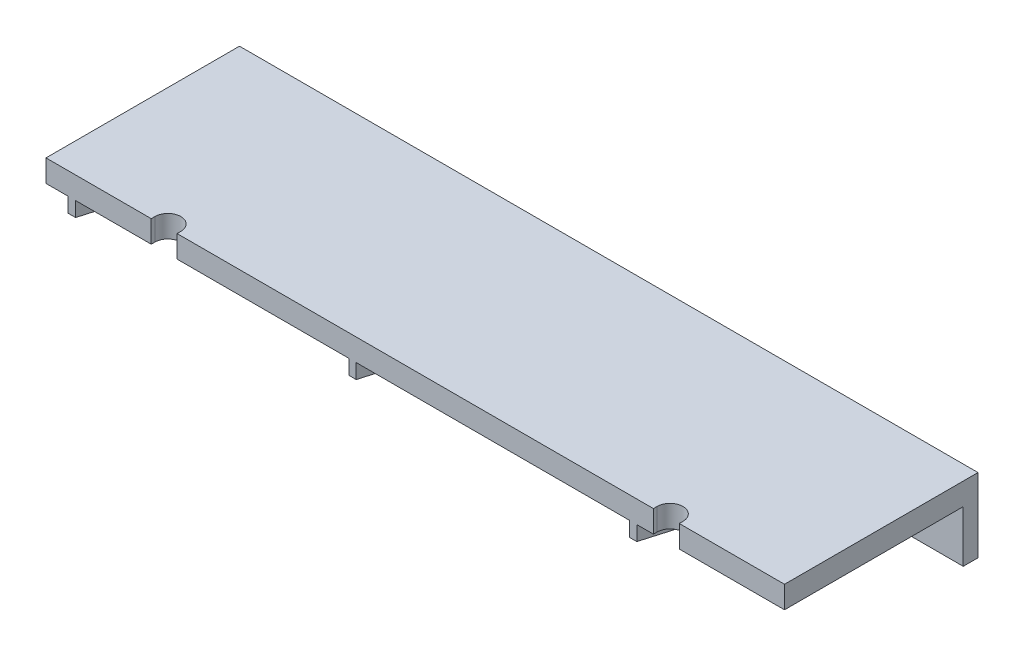
ISO-10303-21;
HEADER;
FILE_DESCRIPTION(('STEP AP214'),'2;1');
FILE_NAME('part.step','',(''),(''),'','','');
FILE_SCHEMA(('AUTOMOTIVE_DESIGN { 1 0 10303 214 1 1 1 1 }'));
ENDSEC;
DATA;
#1=APPLICATION_CONTEXT('core data for automotive mechanical design processes');
#2=APPLICATION_PROTOCOL_DEFINITION('international standard','automotive_design',2000,#1);
#3=PRODUCT_CONTEXT('',#1,'mechanical');
#4=PRODUCT('Part','Part','',(#3));
#5=PRODUCT_RELATED_PRODUCT_CATEGORY('part','',(#4));
#6=PRODUCT_DEFINITION_FORMATION('','',#4);
#7=PRODUCT_DEFINITION_CONTEXT('part definition',#1,'design');
#8=PRODUCT_DEFINITION('design','',#6,#7);
#9=PRODUCT_DEFINITION_SHAPE('','',#8);
#10=(LENGTH_UNIT() NAMED_UNIT(*) SI_UNIT(.MILLI.,.METRE.));
#11=(NAMED_UNIT(*) PLANE_ANGLE_UNIT() SI_UNIT($,.RADIAN.));
#12=(NAMED_UNIT(*) SI_UNIT($,.STERADIAN.) SOLID_ANGLE_UNIT());
#13=UNCERTAINTY_MEASURE_WITH_UNIT(LENGTH_MEASURE(1.E-05),#10,'distance_accuracy_value','');
#14=(GEOMETRIC_REPRESENTATION_CONTEXT(3) GLOBAL_UNCERTAINTY_ASSIGNED_CONTEXT((#13)) GLOBAL_UNIT_ASSIGNED_CONTEXT((#10,
#11,#12)) REPRESENTATION_CONTEXT('',''));
#15=CARTESIAN_POINT('',(0.,0.,0.));
#16=DIRECTION('',(0.,0.,1.));
#17=DIRECTION('',(1.,0.,0.));
#18=AXIS2_PLACEMENT_3D('',#15,#16,#17);
#19=CARTESIAN_POINT('',(-460.,0.,262.));
#20=DIRECTION('',(0.,0.,1.));
#21=DIRECTION('',(1.,0.,0.));
#22=AXIS2_PLACEMENT_3D('',#19,#20,#21);
#23=PLANE('',#22);
#24=DIRECTION('',(0.,1.,0.));
#25=VECTOR('',#24,1.);
#26=CARTESIAN_POINT('',(-322.5,0.,262.));
#27=LINE('',#26,#25);
#28=CARTESIAN_POINT('',(-322.5,20.,262.));
#29=VERTEX_POINT('',#28);
#30=CARTESIAN_POINT('',(-322.5,50.,262.));
#31=VERTEX_POINT('',#30);
#32=EDGE_CURVE('E250',#29,#31,#27,.T.);
#33=ORIENTED_EDGE('',*,*,#32,.F.);
#34=DIRECTION('',(1.,0.,0.));
#35=VECTOR('',#34,1.);
#36=CARTESIAN_POINT('',(-500.,20.,262.));
#37=LINE('',#36,#35);
#38=CARTESIAN_POINT('',(-89.9999999999999,20.,262.));
#39=VERTEX_POINT('',#38);
#40=EDGE_CURVE('E347',#29,#39,#37,.T.);
#41=ORIENTED_EDGE('',*,*,#40,.T.);
#42=DIRECTION('',(0.,1.,0.));
#43=VECTOR('',#42,1.);
#44=CARTESIAN_POINT('',(-89.9999999999999,0.,262.));
#45=LINE('',#44,#43);
#46=CARTESIAN_POINT('',(-89.9999999999999,0.,262.));
#47=VERTEX_POINT('',#46);
#48=EDGE_CURVE('E302',#47,#39,#45,.T.);
#49=ORIENTED_EDGE('',*,*,#48,.F.);
#50=DIRECTION('',(-1.,0.,0.));
#51=VECTOR('',#50,1.);
#52=CARTESIAN_POINT('',(-79.9999999999999,0.,262.));
#53=LINE('',#52,#51);
#54=CARTESIAN_POINT('',(-79.9999999999999,0.,262.));
#55=VERTEX_POINT('',#54);
#56=EDGE_CURVE('E333',#55,#47,#53,.T.);
#57=ORIENTED_EDGE('',*,*,#56,.F.);
#58=DIRECTION('',(0.,1.,0.));
#59=VECTOR('',#58,1.);
#60=CARTESIAN_POINT('',(-79.9999999999999,0.,262.));
#61=LINE('',#60,#59);
#62=CARTESIAN_POINT('',(-79.9999999999999,20.,262.));
#63=VERTEX_POINT('',#62);
#64=EDGE_CURVE('E304',#55,#63,#61,.T.);
#65=ORIENTED_EDGE('',*,*,#64,.T.);
#66=CARTESIAN_POINT('',(290.,20.,262.));
#67=VERTEX_POINT('',#66);
#68=EDGE_CURVE('E496',#63,#67,#37,.T.);
#69=ORIENTED_EDGE('',*,*,#68,.T.);
#70=DIRECTION('',(0.,1.,0.));
#71=VECTOR('',#70,1.);
#72=CARTESIAN_POINT('',(290.,0.,262.));
#73=LINE('',#72,#71);
#74=CARTESIAN_POINT('',(290.,0.,262.));
#75=VERTEX_POINT('',#74);
#76=EDGE_CURVE('E272',#75,#67,#73,.T.);
#77=ORIENTED_EDGE('',*,*,#76,.F.);
#78=DIRECTION('',(-1.,0.,0.));
#79=VECTOR('',#78,1.);
#80=CARTESIAN_POINT('',(300.,0.,262.));
#81=LINE('',#80,#79);
#82=CARTESIAN_POINT('',(300.,0.,262.));
#83=VERTEX_POINT('',#82);
#84=EDGE_CURVE('E300',#83,#75,#81,.T.);
#85=ORIENTED_EDGE('',*,*,#84,.F.);
#86=DIRECTION('',(0.,1.,0.));
#87=VECTOR('',#86,1.);
#88=CARTESIAN_POINT('',(300.,0.,262.));
#89=LINE('',#88,#87);
#90=CARTESIAN_POINT('',(300.,20.,262.));
#91=VERTEX_POINT('',#90);
#92=EDGE_CURVE('E273',#83,#91,#89,.T.);
#93=ORIENTED_EDGE('',*,*,#92,.T.);
#94=CARTESIAN_POINT('',(322.5,20.,262.));
#95=VERTEX_POINT('',#94);
#96=EDGE_CURVE('E499',#91,#95,#37,.T.);
#97=ORIENTED_EDGE('',*,*,#96,.T.);
#98=DIRECTION('',(0.,-1.,0.));
#99=VECTOR('',#98,1.);
#100=CARTESIAN_POINT('',(322.5,0.,262.));
#101=LINE('',#100,#99);
#102=CARTESIAN_POINT('',(322.5,50.,262.));
#103=VERTEX_POINT('',#102);
#104=EDGE_CURVE('E418',#103,#95,#101,.T.);
#105=ORIENTED_EDGE('',*,*,#104,.F.);
#106=DIRECTION('',(-1.,0.,0.));
#107=VECTOR('',#106,1.);
#108=CARTESIAN_POINT('',(-500.,50.,262.));
#109=LINE('',#108,#107);
#110=EDGE_CURVE('E354',#103,#31,#109,.T.);
#111=ORIENTED_EDGE('',*,*,#110,.T.);
#112=EDGE_LOOP('',(#33,#41,#49,#57,#65,#69,#77,#85,#93,#97,#105,#111));
#113=FACE_BOUND('',#112,.T.);
#114=ADVANCED_FACE('F33',(#113),#23,.T.);
#115=DIRECTION('',(0.,1.,0.));
#116=VECTOR('',#115,1.);
#117=CARTESIAN_POINT('',(357.5,0.,262.));
#118=LINE('',#117,#116);
#119=CARTESIAN_POINT('',(357.5,20.,262.));
#120=VERTEX_POINT('',#119);
#121=CARTESIAN_POINT('',(357.5,50.,262.));
#122=VERTEX_POINT('',#121);
#123=EDGE_CURVE('E828',#120,#122,#118,.T.);
#124=ORIENTED_EDGE('',*,*,#123,.F.);
#125=CARTESIAN_POINT('',(500.,20.,262.));
#126=VERTEX_POINT('',#125);
#127=EDGE_CURVE('E340',#120,#126,#37,.T.);
#128=ORIENTED_EDGE('',*,*,#127,.T.);
#129=DIRECTION('',(0.,1.,0.));
#130=VECTOR('',#129,1.);
#131=CARTESIAN_POINT('',(500.,50.,262.));
#132=LINE('',#131,#130);
#133=CARTESIAN_POINT('',(500.,50.,262.));
#134=VERTEX_POINT('',#133);
#135=EDGE_CURVE('E345',#126,#134,#132,.T.);
#136=ORIENTED_EDGE('',*,*,#135,.T.);
#137=EDGE_CURVE('E350',#134,#122,#109,.T.);
#138=ORIENTED_EDGE('',*,*,#137,.T.);
#139=EDGE_LOOP('',(#124,#128,#136,#138));
#140=FACE_BOUND('',#139,.T.);
#141=ADVANCED_FACE('F540',(#140),#23,.T.);
#142=CARTESIAN_POINT('',(0.,0.,20.));
#143=DIRECTION('',(0.,0.,-1.));
#144=DIRECTION('',(-1.,0.,0.));
#145=AXIS2_PLACEMENT_3D('',#142,#143,#144);
#146=PLANE('',#145);
#147=DIRECTION('',(0.,-1.,0.));
#148=VECTOR('',#147,1.);
#149=CARTESIAN_POINT('',(300.,20.,20.));
#150=LINE('',#149,#148);
#151=CARTESIAN_POINT('',(300.,20.,20.));
#152=VERTEX_POINT('',#151);
#153=CARTESIAN_POINT('',(300.,-50.,20.));
#154=VERTEX_POINT('',#153);
#155=EDGE_CURVE('E279',#152,#154,#150,.T.);
#156=ORIENTED_EDGE('',*,*,#155,.T.);
#157=DIRECTION('',(1.,0.,0.));
#158=VECTOR('',#157,1.);
#159=CARTESIAN_POINT('',(-500.,-50.,20.));
#160=LINE('',#159,#158);
#161=CARTESIAN_POINT('',(500.,-50.,20.));
#162=VERTEX_POINT('',#161);
#163=EDGE_CURVE('E399',#154,#162,#160,.T.);
#164=ORIENTED_EDGE('',*,*,#163,.T.);
#165=DIRECTION('',(0.,1.,0.));
#166=VECTOR('',#165,1.);
#167=CARTESIAN_POINT('',(500.,-50.,20.));
#168=LINE('',#167,#166);
#169=CARTESIAN_POINT('',(500.,20.,20.));
#170=VERTEX_POINT('',#169);
#171=EDGE_CURVE('E429',#162,#170,#168,.T.);
#172=ORIENTED_EDGE('',*,*,#171,.T.);
#173=DIRECTION('',(1.,0.,0.));
#174=VECTOR('',#173,1.);
#175=CARTESIAN_POINT('',(-500.,20.,20.));
#176=LINE('',#175,#174);
#177=EDGE_CURVE('E335',#152,#170,#176,.T.);
#178=ORIENTED_EDGE('',*,*,#177,.F.);
#179=EDGE_LOOP('',(#156,#164,#172,#178));
#180=FACE_BOUND('',#179,.T.);
#181=ADVANCED_FACE('F455',(#180),#146,.F.);
#182=CARTESIAN_POINT('',(-500.,20.,262.));
#183=DIRECTION('',(0.,1.,0.));
#184=DIRECTION('',(0.,0.,1.));
#185=AXIS2_PLACEMENT_3D('',#182,#183,#184);
#186=PLANE('',#185);
#187=ORIENTED_EDGE('',*,*,#127,.F.);
#188=DIRECTION('',(0.,0.,-1.));
#189=VECTOR('',#188,1.);
#190=CARTESIAN_POINT('',(357.5,20.,262.));
#191=LINE('',#190,#189);
#192=CARTESIAN_POINT('',(357.5,20.,256.999999998198));
#193=VERTEX_POINT('',#192);
#194=EDGE_CURVE('E266',#120,#193,#191,.T.);
#195=ORIENTED_EDGE('',*,*,#194,.T.);
#196=CARTESIAN_POINT('',(340.,20.,256.999999998198));
#197=DIRECTION('',(0.,1.,0.));
#198=DIRECTION('',(0.,0.,1.));
#199=AXIS2_PLACEMENT_3D('',#196,#197,#198);
#200=CIRCLE('',#199,17.5);
#201=CARTESIAN_POINT('',(322.5,20.,256.999999998198));
#202=VERTEX_POINT('',#201);
#203=EDGE_CURVE('E269',#193,#202,#200,.T.);
#204=ORIENTED_EDGE('',*,*,#203,.T.);
#205=DIRECTION('',(0.,0.,1.));
#206=VECTOR('',#205,1.);
#207=CARTESIAN_POINT('',(322.5,20.,262.));
#208=LINE('',#207,#206);
#209=EDGE_CURVE('E262',#202,#95,#208,.T.);
#210=ORIENTED_EDGE('',*,*,#209,.T.);
#211=ORIENTED_EDGE('',*,*,#96,.F.);
#212=DIRECTION('',(0.,0.,-1.));
#213=VECTOR('',#212,1.);
#214=CARTESIAN_POINT('',(300.,20.,262.));
#215=LINE('',#214,#213);
#216=EDGE_CURVE('E275',#91,#152,#215,.T.);
#217=ORIENTED_EDGE('',*,*,#216,.T.);
#218=ORIENTED_EDGE('',*,*,#177,.T.);
#219=DIRECTION('',(0.,0.,-1.));
#220=VECTOR('',#219,1.);
#221=CARTESIAN_POINT('',(500.,20.,262.));
#222=LINE('',#221,#220);
#223=EDGE_CURVE('E353',#126,#170,#222,.T.);
#224=ORIENTED_EDGE('',*,*,#223,.F.);
#225=EDGE_LOOP('',(#187,#195,#204,#210,#211,#217,#218,#224));
#226=FACE_BOUND('',#225,.T.);
#227=ADVANCED_FACE('F463',(#226),#186,.F.);
#228=CARTESIAN_POINT('',(-79.9999999999999,-50.,20.));
#229=VERTEX_POINT('',#228);
#230=CARTESIAN_POINT('',(290.,-50.,20.));
#231=VERTEX_POINT('',#230);
#232=EDGE_CURVE('E396',#229,#231,#160,.T.);
#233=ORIENTED_EDGE('',*,*,#232,.T.);
#234=DIRECTION('',(0.,-1.,0.));
#235=VECTOR('',#234,1.);
#236=CARTESIAN_POINT('',(290.,20.,20.));
#237=LINE('',#236,#235);
#238=CARTESIAN_POINT('',(290.,20.,20.));
#239=VERTEX_POINT('',#238);
#240=EDGE_CURVE('E292',#239,#231,#237,.T.);
#241=ORIENTED_EDGE('',*,*,#240,.F.);
#242=CARTESIAN_POINT('',(-79.9999999999999,20.,20.));
#243=VERTEX_POINT('',#242);
#244=EDGE_CURVE('E466',#243,#239,#176,.T.);
#245=ORIENTED_EDGE('',*,*,#244,.F.);
#246=DIRECTION('',(0.,-1.,0.));
#247=VECTOR('',#246,1.);
#248=CARTESIAN_POINT('',(-79.9999999999999,20.,20.));
#249=LINE('',#248,#247);
#250=EDGE_CURVE('E311',#243,#229,#249,.T.);
#251=ORIENTED_EDGE('',*,*,#250,.T.);
#252=EDGE_LOOP('',(#233,#241,#245,#251));
#253=FACE_BOUND('',#252,.T.);
#254=ADVANCED_FACE('F565',(#253),#146,.F.);
#255=ORIENTED_EDGE('',*,*,#244,.T.);
#256=DIRECTION('',(0.,0.,-1.));
#257=VECTOR('',#256,1.);
#258=CARTESIAN_POINT('',(290.,20.,262.));
#259=LINE('',#258,#257);
#260=EDGE_CURVE('E290',#67,#239,#259,.T.);
#261=ORIENTED_EDGE('',*,*,#260,.F.);
#262=ORIENTED_EDGE('',*,*,#68,.F.);
#263=DIRECTION('',(0.,0.,-1.));
#264=VECTOR('',#263,1.);
#265=CARTESIAN_POINT('',(-79.9999999999999,20.,262.));
#266=LINE('',#265,#264);
#267=EDGE_CURVE('E307',#63,#243,#266,.T.);
#268=ORIENTED_EDGE('',*,*,#267,.T.);
#269=EDGE_LOOP('',(#255,#261,#262,#268));
#270=FACE_BOUND('',#269,.T.);
#271=ADVANCED_FACE('F550',(#270),#186,.F.);
#272=CARTESIAN_POINT('',(-500.,20.,20.));
#273=VERTEX_POINT('',#272);
#274=CARTESIAN_POINT('',(-470.,20.,20.));
#275=VERTEX_POINT('',#274);
#276=EDGE_CURVE('E341',#273,#275,#176,.T.);
#277=ORIENTED_EDGE('',*,*,#276,.F.);
#278=DIRECTION('',(0.,-1.,0.));
#279=VECTOR('',#278,1.);
#280=CARTESIAN_POINT('',(-500.,-50.,20.));
#281=LINE('',#280,#279);
#282=CARTESIAN_POINT('',(-500.,-50.,20.));
#283=VERTEX_POINT('',#282);
#284=EDGE_CURVE('E404',#273,#283,#281,.T.);
#285=ORIENTED_EDGE('',*,*,#284,.T.);
#286=CARTESIAN_POINT('',(-470.,-50.,20.));
#287=VERTEX_POINT('',#286);
#288=EDGE_CURVE('E411',#283,#287,#160,.T.);
#289=ORIENTED_EDGE('',*,*,#288,.T.);
#290=DIRECTION('',(0.,-1.,0.));
#291=VECTOR('',#290,1.);
#292=CARTESIAN_POINT('',(-470.,20.,20.));
#293=LINE('',#292,#291);
#294=EDGE_CURVE('E388',#275,#287,#293,.T.);
#295=ORIENTED_EDGE('',*,*,#294,.F.);
#296=EDGE_LOOP('',(#277,#285,#289,#295));
#297=FACE_BOUND('',#296,.T.);
#298=ADVANCED_FACE('F523',(#297),#146,.F.);
#299=CARTESIAN_POINT('',(-460.,-50.,20.));
#300=VERTEX_POINT('',#299);
#301=CARTESIAN_POINT('',(-89.9999999999999,-50.,20.));
#302=VERTEX_POINT('',#301);
#303=EDGE_CURVE('E378',#300,#302,#160,.T.);
#304=ORIENTED_EDGE('',*,*,#303,.T.);
#305=DIRECTION('',(0.,-1.,0.));
#306=VECTOR('',#305,1.);
#307=CARTESIAN_POINT('',(-89.9999999999999,20.,20.));
#308=LINE('',#307,#306);
#309=CARTESIAN_POINT('',(-89.9999999999999,20.,20.));
#310=VERTEX_POINT('',#309);
#311=EDGE_CURVE('E325',#310,#302,#308,.T.);
#312=ORIENTED_EDGE('',*,*,#311,.F.);
#313=CARTESIAN_POINT('',(-460.,20.,20.));
#314=VERTEX_POINT('',#313);
#315=EDGE_CURVE('E356',#314,#310,#176,.T.);
#316=ORIENTED_EDGE('',*,*,#315,.F.);
#317=DIRECTION('',(0.,-1.,0.));
#318=VECTOR('',#317,1.);
#319=CARTESIAN_POINT('',(-460.,20.,20.));
#320=LINE('',#319,#318);
#321=EDGE_CURVE('E368',#314,#300,#320,.T.);
#322=ORIENTED_EDGE('',*,*,#321,.T.);
#323=EDGE_LOOP('',(#304,#312,#316,#322));
#324=FACE_BOUND('',#323,.T.);
#325=ADVANCED_FACE('F482',(#324),#146,.F.);
#326=CARTESIAN_POINT('',(500.,-50.,20.));
#327=DIRECTION('',(-1.,0.,0.));
#328=DIRECTION('',(0.,0.,1.));
#329=AXIS2_PLACEMENT_3D('',#326,#327,#328);
#330=PLANE('',#329);
#331=DIRECTION('',(0.,1.,0.));
#332=VECTOR('',#331,1.);
#333=CARTESIAN_POINT('',(500.,-50.,0.));
#334=LINE('',#333,#332);
#335=CARTESIAN_POINT('',(500.,-50.,0.));
#336=VERTEX_POINT('',#335);
#337=CARTESIAN_POINT('',(500.,50.,0.));
#338=VERTEX_POINT('',#337);
#339=EDGE_CURVE('E406',#336,#338,#334,.T.);
#340=ORIENTED_EDGE('',*,*,#339,.T.);
#341=DIRECTION('',(0.,0.,-1.));
#342=VECTOR('',#341,1.);
#343=CARTESIAN_POINT('',(500.,50.,20.));
#344=LINE('',#343,#342);
#345=EDGE_CURVE('E415',#134,#338,#344,.T.);
#346=ORIENTED_EDGE('',*,*,#345,.F.);
#347=ORIENTED_EDGE('',*,*,#135,.F.);
#348=ORIENTED_EDGE('',*,*,#223,.T.);
#349=ORIENTED_EDGE('',*,*,#171,.F.);
#350=DIRECTION('',(0.,0.,-1.));
#351=VECTOR('',#350,1.);
#352=CARTESIAN_POINT('',(500.,-50.,20.));
#353=LINE('',#352,#351);
#354=EDGE_CURVE('E414',#162,#336,#353,.T.);
#355=ORIENTED_EDGE('',*,*,#354,.T.);
#356=EDGE_LOOP('',(#340,#346,#347,#348,#349,#355));
#357=FACE_BOUND('',#356,.T.);
#358=ADVANCED_FACE('F35',(#357),#330,.F.);
#359=CARTESIAN_POINT('',(-500.,50.,20.));
#360=DIRECTION('',(0.,-1.,0.));
#361=DIRECTION('',(0.,0.,-1.));
#362=AXIS2_PLACEMENT_3D('',#359,#360,#361);
#363=PLANE('',#362);
#364=CARTESIAN_POINT('',(-340.,50.,257.000000000005));
#365=DIRECTION('',(0.,1.,0.));
#366=DIRECTION('',(0.,0.,1.));
#367=AXIS2_PLACEMENT_3D('',#364,#365,#366);
#368=CIRCLE('',#367,17.5);
#369=CARTESIAN_POINT('',(-322.5,50.,257.000000000005));
#370=VERTEX_POINT('',#369);
#371=CARTESIAN_POINT('',(-357.5,50.,257.000000000005));
#372=VERTEX_POINT('',#371);
#373=EDGE_CURVE('E234',#370,#372,#368,.T.);
#374=ORIENTED_EDGE('',*,*,#373,.F.);
#375=DIRECTION('',(0.,0.,-1.));
#376=VECTOR('',#375,1.);
#377=CARTESIAN_POINT('',(-322.5,50.,257.000000000005));
#378=LINE('',#377,#376);
#379=EDGE_CURVE('E231',#31,#370,#378,.T.);
#380=ORIENTED_EDGE('',*,*,#379,.F.);
#381=ORIENTED_EDGE('',*,*,#110,.F.);
#382=DIRECTION('',(0.,0.,1.));
#383=VECTOR('',#382,1.);
#384=CARTESIAN_POINT('',(322.5,50.,256.999999998198));
#385=LINE('',#384,#383);
#386=CARTESIAN_POINT('',(322.5,50.,256.999999998198));
#387=VERTEX_POINT('',#386);
#388=EDGE_CURVE('E56',#387,#103,#385,.T.);
#389=ORIENTED_EDGE('',*,*,#388,.F.);
#390=CARTESIAN_POINT('',(340.,50.,256.999999998198));
#391=DIRECTION('',(0.,1.,0.));
#392=DIRECTION('',(0.,0.,1.));
#393=AXIS2_PLACEMENT_3D('',#390,#391,#392);
#394=CIRCLE('',#393,17.5);
#395=CARTESIAN_POINT('',(357.5,50.,256.999999998198));
#396=VERTEX_POINT('',#395);
#397=EDGE_CURVE('E252',#396,#387,#394,.T.);
#398=ORIENTED_EDGE('',*,*,#397,.F.);
#399=DIRECTION('',(0.,0.,-1.));
#400=VECTOR('',#399,1.);
#401=CARTESIAN_POINT('',(357.5,50.,256.999999998198));
#402=LINE('',#401,#400);
#403=EDGE_CURVE('E256',#122,#396,#402,.T.);
#404=ORIENTED_EDGE('',*,*,#403,.F.);
#405=ORIENTED_EDGE('',*,*,#137,.F.);
#406=ORIENTED_EDGE('',*,*,#345,.T.);
#407=DIRECTION('',(-1.,0.,0.));
#408=VECTOR('',#407,1.);
#409=CARTESIAN_POINT('',(-500.,50.,0.));
#410=LINE('',#409,#408);
#411=CARTESIAN_POINT('',(-500.,50.,0.));
#412=VERTEX_POINT('',#411);
#413=EDGE_CURVE('E431',#338,#412,#410,.T.);
#414=ORIENTED_EDGE('',*,*,#413,.T.);
#415=DIRECTION('',(0.,0.,-1.));
#416=VECTOR('',#415,1.);
#417=CARTESIAN_POINT('',(-500.,50.,20.));
#418=LINE('',#417,#416);
#419=CARTESIAN_POINT('',(-500.,50.,262.));
#420=VERTEX_POINT('',#419);
#421=EDGE_CURVE('E419',#420,#412,#418,.T.);
#422=ORIENTED_EDGE('',*,*,#421,.F.);
#423=CARTESIAN_POINT('',(-357.5,50.,262.));
#424=VERTEX_POINT('',#423);
#425=EDGE_CURVE('E244',#424,#420,#109,.T.);
#426=ORIENTED_EDGE('',*,*,#425,.F.);
#427=DIRECTION('',(0.,0.,1.));
#428=VECTOR('',#427,1.);
#429=CARTESIAN_POINT('',(-357.5,50.,257.000000000005));
#430=LINE('',#429,#428);
#431=EDGE_CURVE('E226',#372,#424,#430,.T.);
#432=ORIENTED_EDGE('',*,*,#431,.F.);
#433=EDGE_LOOP('',(#374,#380,#381,#389,#398,#404,#405,#406,#414,#422,#426,#432));
#434=FACE_BOUND('',#433,.T.);
#435=ADVANCED_FACE('F242',(#434),#363,.F.);
#436=CARTESIAN_POINT('',(-500.,-50.,20.));
#437=DIRECTION('',(1.,0.,0.));
#438=DIRECTION('',(0.,0.,-1.));
#439=AXIS2_PLACEMENT_3D('',#436,#437,#438);
#440=PLANE('',#439);
#441=DIRECTION('',(0.,-1.,0.));
#442=VECTOR('',#441,1.);
#443=CARTESIAN_POINT('',(-500.,-50.,0.));
#444=LINE('',#443,#442);
#445=CARTESIAN_POINT('',(-500.,-50.,0.));
#446=VERTEX_POINT('',#445);
#447=EDGE_CURVE('E430',#412,#446,#444,.T.);
#448=ORIENTED_EDGE('',*,*,#447,.T.);
#449=DIRECTION('',(0.,0.,-1.));
#450=VECTOR('',#449,1.);
#451=CARTESIAN_POINT('',(-500.,-50.,20.));
#452=LINE('',#451,#450);
#453=EDGE_CURVE('E422',#283,#446,#452,.T.);
#454=ORIENTED_EDGE('',*,*,#453,.F.);
#455=ORIENTED_EDGE('',*,*,#284,.F.);
#456=DIRECTION('',(0.,0.,-1.));
#457=VECTOR('',#456,1.);
#458=CARTESIAN_POINT('',(-500.,20.,262.));
#459=LINE('',#458,#457);
#460=CARTESIAN_POINT('',(-500.,20.,262.));
#461=VERTEX_POINT('',#460);
#462=EDGE_CURVE('E359',#461,#273,#459,.T.);
#463=ORIENTED_EDGE('',*,*,#462,.F.);
#464=DIRECTION('',(0.,-1.,0.));
#465=VECTOR('',#464,1.);
#466=CARTESIAN_POINT('',(-500.,50.,262.));
#467=LINE('',#466,#465);
#468=EDGE_CURVE('E337',#420,#461,#467,.T.);
#469=ORIENTED_EDGE('',*,*,#468,.F.);
#470=ORIENTED_EDGE('',*,*,#421,.T.);
#471=EDGE_LOOP('',(#448,#454,#455,#463,#469,#470));
#472=FACE_BOUND('',#471,.T.);
#473=ADVANCED_FACE('F518',(#472),#440,.F.);
#474=CARTESIAN_POINT('',(-500.,-50.,20.));
#475=DIRECTION('',(0.,1.,0.));
#476=DIRECTION('',(0.,0.,1.));
#477=AXIS2_PLACEMENT_3D('',#474,#475,#476);
#478=PLANE('',#477);
#479=DIRECTION('',(1.,0.,0.));
#480=VECTOR('',#479,1.);
#481=CARTESIAN_POINT('',(-500.,-50.,0.));
#482=LINE('',#481,#480);
#483=EDGE_CURVE('E427',#446,#336,#482,.T.);
#484=ORIENTED_EDGE('',*,*,#483,.T.);
#485=ORIENTED_EDGE('',*,*,#354,.F.);
#486=ORIENTED_EDGE('',*,*,#163,.F.);
#487=DIRECTION('',(0.,0.,1.));
#488=VECTOR('',#487,1.);
#489=CARTESIAN_POINT('',(300.,-50.,20.));
#490=LINE('',#489,#488);
#491=CARTESIAN_POINT('',(300.,-50.,40.));
#492=VERTEX_POINT('',#491);
#493=EDGE_CURVE('E282',#154,#492,#490,.T.);
#494=ORIENTED_EDGE('',*,*,#493,.T.);
#495=DIRECTION('',(-1.,0.,0.));
#496=VECTOR('',#495,1.);
#497=CARTESIAN_POINT('',(300.,-50.,40.));
#498=LINE('',#497,#496);
#499=CARTESIAN_POINT('',(290.,-50.,40.));
#500=VERTEX_POINT('',#499);
#501=EDGE_CURVE('E288',#492,#500,#498,.T.);
#502=ORIENTED_EDGE('',*,*,#501,.T.);
#503=DIRECTION('',(0.,0.,1.));
#504=VECTOR('',#503,1.);
#505=CARTESIAN_POINT('',(290.,-50.,20.));
#506=LINE('',#505,#504);
#507=EDGE_CURVE('E295',#231,#500,#506,.T.);
#508=ORIENTED_EDGE('',*,*,#507,.F.);
#509=ORIENTED_EDGE('',*,*,#232,.F.);
#510=DIRECTION('',(0.,0.,1.));
#511=VECTOR('',#510,1.);
#512=CARTESIAN_POINT('',(-79.9999999999999,-50.,20.));
#513=LINE('',#512,#511);
#514=CARTESIAN_POINT('',(-79.9999999999999,-50.,40.));
#515=VERTEX_POINT('',#514);
#516=EDGE_CURVE('E314',#229,#515,#513,.T.);
#517=ORIENTED_EDGE('',*,*,#516,.T.);
#518=DIRECTION('',(-1.,0.,0.));
#519=VECTOR('',#518,1.);
#520=CARTESIAN_POINT('',(-79.9999999999999,-50.,40.));
#521=LINE('',#520,#519);
#522=CARTESIAN_POINT('',(-89.9999999999999,-50.,40.));
#523=VERTEX_POINT('',#522);
#524=EDGE_CURVE('E320',#515,#523,#521,.T.);
#525=ORIENTED_EDGE('',*,*,#524,.T.);
#526=DIRECTION('',(0.,0.,1.));
#527=VECTOR('',#526,1.);
#528=CARTESIAN_POINT('',(-89.9999999999999,-50.,20.));
#529=LINE('',#528,#527);
#530=EDGE_CURVE('E328',#302,#523,#529,.T.);
#531=ORIENTED_EDGE('',*,*,#530,.F.);
#532=ORIENTED_EDGE('',*,*,#303,.F.);
#533=DIRECTION('',(0.,0.,1.));
#534=VECTOR('',#533,1.);
#535=CARTESIAN_POINT('',(-460.,-50.,20.));
#536=LINE('',#535,#534);
#537=CARTESIAN_POINT('',(-460.,-50.,40.));
#538=VERTEX_POINT('',#537);
#539=EDGE_CURVE('E377',#300,#538,#536,.T.);
#540=ORIENTED_EDGE('',*,*,#539,.T.);
#541=DIRECTION('',(-1.,0.,0.));
#542=VECTOR('',#541,1.);
#543=CARTESIAN_POINT('',(-460.,-50.,40.));
#544=LINE('',#543,#542);
#545=CARTESIAN_POINT('',(-470.,-50.,40.));
#546=VERTEX_POINT('',#545);
#547=EDGE_CURVE('E436',#538,#546,#544,.T.);
#548=ORIENTED_EDGE('',*,*,#547,.T.);
#549=DIRECTION('',(0.,0.,1.));
#550=VECTOR('',#549,1.);
#551=CARTESIAN_POINT('',(-470.,-50.,20.));
#552=LINE('',#551,#550);
#553=EDGE_CURVE('E385',#287,#546,#552,.T.);
#554=ORIENTED_EDGE('',*,*,#553,.F.);
#555=ORIENTED_EDGE('',*,*,#288,.F.);
#556=ORIENTED_EDGE('',*,*,#453,.T.);
#557=EDGE_LOOP('',(#484,#485,#486,#494,#502,#508,#509,#517,#525,#531,#532,#540,#548,#554,#555,#556));
#558=FACE_BOUND('',#557,.T.);
#559=ADVANCED_FACE('F457',(#558),#478,.F.);
#560=CARTESIAN_POINT('',(0.,0.,0.));
#561=DIRECTION('',(0.,0.,-1.));
#562=DIRECTION('',(-1.,0.,0.));
#563=AXIS2_PLACEMENT_3D('',#560,#561,#562);
#564=PLANE('',#563);
#565=ORIENTED_EDGE('',*,*,#339,.F.);
#566=ORIENTED_EDGE('',*,*,#483,.F.);
#567=ORIENTED_EDGE('',*,*,#447,.F.);
#568=ORIENTED_EDGE('',*,*,#413,.F.);
#569=EDGE_LOOP('',(#565,#566,#567,#568));
#570=FACE_BOUND('',#569,.T.);
#571=ADVANCED_FACE('F538',(#570),#564,.T.);
#572=DIRECTION('',(0.,-1.,0.));
#573=VECTOR('',#572,1.);
#574=CARTESIAN_POINT('',(-357.5,0.,262.));
#575=LINE('',#574,#573);
#576=CARTESIAN_POINT('',(-357.5,20.,262.));
#577=VERTEX_POINT('',#576);
#578=EDGE_CURVE('E48',#424,#577,#575,.T.);
#579=ORIENTED_EDGE('',*,*,#578,.F.);
#580=ORIENTED_EDGE('',*,*,#425,.T.);
#581=ORIENTED_EDGE('',*,*,#468,.T.);
#582=CARTESIAN_POINT('',(-470.,20.,262.));
#583=VERTEX_POINT('',#582);
#584=EDGE_CURVE('E342',#461,#583,#37,.T.);
#585=ORIENTED_EDGE('',*,*,#584,.T.);
#586=DIRECTION('',(0.,1.,0.));
#587=VECTOR('',#586,1.);
#588=CARTESIAN_POINT('',(-470.,0.,262.));
#589=LINE('',#588,#587);
#590=CARTESIAN_POINT('',(-470.,0.,262.));
#591=VERTEX_POINT('',#590);
#592=EDGE_CURVE('E361',#591,#583,#589,.T.);
#593=ORIENTED_EDGE('',*,*,#592,.F.);
#594=DIRECTION('',(-1.,0.,0.));
#595=VECTOR('',#594,1.);
#596=CARTESIAN_POINT('',(-460.,0.,262.));
#597=LINE('',#596,#595);
#598=CARTESIAN_POINT('',(-460.,0.,262.));
#599=VERTEX_POINT('',#598);
#600=EDGE_CURVE('E433',#599,#591,#597,.T.);
#601=ORIENTED_EDGE('',*,*,#600,.F.);
#602=DIRECTION('',(0.,1.,0.));
#603=VECTOR('',#602,1.);
#604=CARTESIAN_POINT('',(-460.,0.,262.));
#605=LINE('',#604,#603);
#606=CARTESIAN_POINT('',(-460.,20.,262.));
#607=VERTEX_POINT('',#606);
#608=EDGE_CURVE('E362',#599,#607,#605,.T.);
#609=ORIENTED_EDGE('',*,*,#608,.T.);
#610=EDGE_CURVE('E346',#607,#577,#37,.T.);
#611=ORIENTED_EDGE('',*,*,#610,.T.);
#612=EDGE_LOOP('',(#579,#580,#581,#585,#593,#601,#609,#611));
#613=FACE_BOUND('',#612,.T.);
#614=ADVANCED_FACE('F513',(#613),#23,.T.);
#615=CARTESIAN_POINT('',(-460.,-50.,40.));
#616=DIRECTION('',(0.,-0.975562678550501,0.21972132399786));
#617=DIRECTION('',(0.,-0.21972132399786,-0.975562678550501));
#618=AXIS2_PLACEMENT_3D('',#615,#616,#617);
#619=PLANE('',#618);
#620=DIRECTION('',(0.,0.21972132399786,0.9755626785505));
#621=VECTOR('',#620,1.);
#622=CARTESIAN_POINT('',(-470.,-50.,40.));
#623=LINE('',#622,#621);
#624=EDGE_CURVE('E366',#546,#591,#623,.T.);
#625=ORIENTED_EDGE('',*,*,#624,.F.);
#626=ORIENTED_EDGE('',*,*,#547,.F.);
#627=DIRECTION('',(0.,0.21972132399786,0.9755626785505));
#628=VECTOR('',#627,1.);
#629=CARTESIAN_POINT('',(-460.,-50.,40.));
#630=LINE('',#629,#628);
#631=EDGE_CURVE('E371',#538,#599,#630,.T.);
#632=ORIENTED_EDGE('',*,*,#631,.T.);
#633=ORIENTED_EDGE('',*,*,#600,.T.);
#634=EDGE_LOOP('',(#625,#626,#632,#633));
#635=FACE_BOUND('',#634,.T.);
#636=ADVANCED_FACE('F529',(#635),#619,.T.);
#637=CARTESIAN_POINT('',(-460.,0.,0.));
#638=DIRECTION('',(-1.,0.,0.));
#639=DIRECTION('',(0.,0.,1.));
#640=AXIS2_PLACEMENT_3D('',#637,#638,#639);
#641=PLANE('',#640);
#642=ORIENTED_EDGE('',*,*,#608,.F.);
#643=ORIENTED_EDGE('',*,*,#631,.F.);
#644=ORIENTED_EDGE('',*,*,#539,.F.);
#645=ORIENTED_EDGE('',*,*,#321,.F.);
#646=DIRECTION('',(0.,0.,-1.));
#647=VECTOR('',#646,1.);
#648=CARTESIAN_POINT('',(-460.,20.,262.));
#649=LINE('',#648,#647);
#650=EDGE_CURVE('E365',#607,#314,#649,.T.);
#651=ORIENTED_EDGE('',*,*,#650,.F.);
#652=EDGE_LOOP('',(#642,#643,#644,#645,#651));
#653=FACE_BOUND('',#652,.T.);
#654=ADVANCED_FACE('F486',(#653),#641,.F.);
#655=CARTESIAN_POINT('',(-470.,0.,0.));
#656=DIRECTION('',(-1.,0.,0.));
#657=DIRECTION('',(0.,0.,1.));
#658=AXIS2_PLACEMENT_3D('',#655,#656,#657);
#659=PLANE('',#658);
#660=ORIENTED_EDGE('',*,*,#592,.T.);
#661=DIRECTION('',(0.,0.,-1.));
#662=VECTOR('',#661,1.);
#663=CARTESIAN_POINT('',(-470.,20.,262.));
#664=LINE('',#663,#662);
#665=EDGE_CURVE('E393',#583,#275,#664,.T.);
#666=ORIENTED_EDGE('',*,*,#665,.T.);
#667=ORIENTED_EDGE('',*,*,#294,.T.);
#668=ORIENTED_EDGE('',*,*,#553,.T.);
#669=ORIENTED_EDGE('',*,*,#624,.T.);
#670=EDGE_LOOP('',(#660,#666,#667,#668,#669));
#671=FACE_BOUND('',#670,.T.);
#672=ADVANCED_FACE('F527',(#671),#659,.T.);
#673=ORIENTED_EDGE('',*,*,#40,.F.);
#674=DIRECTION('',(0.,0.,-1.));
#675=VECTOR('',#674,1.);
#676=CARTESIAN_POINT('',(-322.5,20.,262.));
#677=LINE('',#676,#675);
#678=CARTESIAN_POINT('',(-322.5,20.,257.000000000005));
#679=VERTEX_POINT('',#678);
#680=EDGE_CURVE('E11',#29,#679,#677,.T.);
#681=ORIENTED_EDGE('',*,*,#680,.T.);
#682=CARTESIAN_POINT('',(-340.,20.,257.000000000005));
#683=DIRECTION('',(0.,1.,0.));
#684=DIRECTION('',(0.,0.,1.));
#685=AXIS2_PLACEMENT_3D('',#682,#683,#684);
#686=CIRCLE('',#685,17.5);
#687=CARTESIAN_POINT('',(-357.5,20.,257.000000000005));
#688=VERTEX_POINT('',#687);
#689=EDGE_CURVE('E41',#679,#688,#686,.T.);
#690=ORIENTED_EDGE('',*,*,#689,.T.);
#691=DIRECTION('',(0.,0.,1.));
#692=VECTOR('',#691,1.);
#693=CARTESIAN_POINT('',(-357.5,20.,262.));
#694=LINE('',#693,#692);
#695=EDGE_CURVE('E227',#688,#577,#694,.T.);
#696=ORIENTED_EDGE('',*,*,#695,.T.);
#697=ORIENTED_EDGE('',*,*,#610,.F.);
#698=ORIENTED_EDGE('',*,*,#650,.T.);
#699=ORIENTED_EDGE('',*,*,#315,.T.);
#700=DIRECTION('',(0.,0.,-1.));
#701=VECTOR('',#700,1.);
#702=CARTESIAN_POINT('',(-89.9999999999999,20.,262.));
#703=LINE('',#702,#701);
#704=EDGE_CURVE('E323',#39,#310,#703,.T.);
#705=ORIENTED_EDGE('',*,*,#704,.F.);
#706=EDGE_LOOP('',(#673,#681,#690,#696,#697,#698,#699,#705));
#707=FACE_BOUND('',#706,.T.);
#708=ADVANCED_FACE('F476',(#707),#186,.F.);
#709=ORIENTED_EDGE('',*,*,#665,.F.);
#710=ORIENTED_EDGE('',*,*,#584,.F.);
#711=ORIENTED_EDGE('',*,*,#462,.T.);
#712=ORIENTED_EDGE('',*,*,#276,.T.);
#713=EDGE_LOOP('',(#709,#710,#711,#712));
#714=FACE_BOUND('',#713,.T.);
#715=ADVANCED_FACE('F520',(#714),#186,.F.);
#716=CARTESIAN_POINT('',(-79.9999999999999,-50.,40.));
#717=DIRECTION('',(0.,-0.975562678550501,0.21972132399786));
#718=DIRECTION('',(0.,-0.21972132399786,-0.975562678550501));
#719=AXIS2_PLACEMENT_3D('',#716,#717,#718);
#720=PLANE('',#719);
#721=DIRECTION('',(0.,0.21972132399786,0.9755626785505));
#722=VECTOR('',#721,1.);
#723=CARTESIAN_POINT('',(-89.9999999999999,-50.,40.));
#724=LINE('',#723,#722);
#725=EDGE_CURVE('E308',#523,#47,#724,.T.);
#726=ORIENTED_EDGE('',*,*,#725,.F.);
#727=ORIENTED_EDGE('',*,*,#524,.F.);
#728=DIRECTION('',(0.,0.21972132399786,0.9755626785505));
#729=VECTOR('',#728,1.);
#730=CARTESIAN_POINT('',(-79.9999999999999,-50.,40.));
#731=LINE('',#730,#729);
#732=EDGE_CURVE('E317',#515,#55,#731,.T.);
#733=ORIENTED_EDGE('',*,*,#732,.T.);
#734=ORIENTED_EDGE('',*,*,#56,.T.);
#735=EDGE_LOOP('',(#726,#727,#733,#734));
#736=FACE_BOUND('',#735,.T.);
#737=ADVANCED_FACE('F675',(#736),#720,.T.);
#738=CARTESIAN_POINT('',(-79.9999999999999,0.,0.));
#739=DIRECTION('',(-1.,0.,0.));
#740=DIRECTION('',(0.,0.,1.));
#741=AXIS2_PLACEMENT_3D('',#738,#739,#740);
#742=PLANE('',#741);
#743=ORIENTED_EDGE('',*,*,#64,.F.);
#744=ORIENTED_EDGE('',*,*,#732,.F.);
#745=ORIENTED_EDGE('',*,*,#516,.F.);
#746=ORIENTED_EDGE('',*,*,#250,.F.);
#747=ORIENTED_EDGE('',*,*,#267,.F.);
#748=EDGE_LOOP('',(#743,#744,#745,#746,#747));
#749=FACE_BOUND('',#748,.T.);
#750=ADVANCED_FACE('F672',(#749),#742,.F.);
#751=CARTESIAN_POINT('',(-89.9999999999999,0.,0.));
#752=DIRECTION('',(-1.,0.,0.));
#753=DIRECTION('',(0.,0.,1.));
#754=AXIS2_PLACEMENT_3D('',#751,#752,#753);
#755=PLANE('',#754);
#756=ORIENTED_EDGE('',*,*,#48,.T.);
#757=ORIENTED_EDGE('',*,*,#704,.T.);
#758=ORIENTED_EDGE('',*,*,#311,.T.);
#759=ORIENTED_EDGE('',*,*,#530,.T.);
#760=ORIENTED_EDGE('',*,*,#725,.T.);
#761=EDGE_LOOP('',(#756,#757,#758,#759,#760));
#762=FACE_BOUND('',#761,.T.);
#763=ADVANCED_FACE('F490',(#762),#755,.T.);
#764=CARTESIAN_POINT('',(300.,-50.,40.));
#765=DIRECTION('',(0.,-0.975562678550501,0.21972132399786));
#766=DIRECTION('',(0.,-0.21972132399786,-0.975562678550501));
#767=AXIS2_PLACEMENT_3D('',#764,#765,#766);
#768=PLANE('',#767);
#769=DIRECTION('',(0.,0.21972132399786,0.9755626785505));
#770=VECTOR('',#769,1.);
#771=CARTESIAN_POINT('',(290.,-50.,40.));
#772=LINE('',#771,#770);
#773=EDGE_CURVE('E276',#500,#75,#772,.T.);
#774=ORIENTED_EDGE('',*,*,#773,.F.);
#775=ORIENTED_EDGE('',*,*,#501,.F.);
#776=DIRECTION('',(0.,0.21972132399786,0.9755626785505));
#777=VECTOR('',#776,1.);
#778=CARTESIAN_POINT('',(300.,-50.,40.));
#779=LINE('',#778,#777);
#780=EDGE_CURVE('E285',#492,#83,#779,.T.);
#781=ORIENTED_EDGE('',*,*,#780,.T.);
#782=ORIENTED_EDGE('',*,*,#84,.T.);
#783=EDGE_LOOP('',(#774,#775,#781,#782));
#784=FACE_BOUND('',#783,.T.);
#785=ADVANCED_FACE('F664',(#784),#768,.T.);
#786=CARTESIAN_POINT('',(300.,0.,0.));
#787=DIRECTION('',(-1.,0.,0.));
#788=DIRECTION('',(0.,0.,1.));
#789=AXIS2_PLACEMENT_3D('',#786,#787,#788);
#790=PLANE('',#789);
#791=ORIENTED_EDGE('',*,*,#92,.F.);
#792=ORIENTED_EDGE('',*,*,#780,.F.);
#793=ORIENTED_EDGE('',*,*,#493,.F.);
#794=ORIENTED_EDGE('',*,*,#155,.F.);
#795=ORIENTED_EDGE('',*,*,#216,.F.);
#796=EDGE_LOOP('',(#791,#792,#793,#794,#795));
#797=FACE_BOUND('',#796,.T.);
#798=ADVANCED_FACE('F661',(#797),#790,.F.);
#799=CARTESIAN_POINT('',(290.,0.,0.));
#800=DIRECTION('',(-1.,0.,0.));
#801=DIRECTION('',(0.,0.,1.));
#802=AXIS2_PLACEMENT_3D('',#799,#800,#801);
#803=PLANE('',#802);
#804=ORIENTED_EDGE('',*,*,#76,.T.);
#805=ORIENTED_EDGE('',*,*,#260,.T.);
#806=ORIENTED_EDGE('',*,*,#240,.T.);
#807=ORIENTED_EDGE('',*,*,#507,.T.);
#808=ORIENTED_EDGE('',*,*,#773,.T.);
#809=EDGE_LOOP('',(#804,#805,#806,#807,#808));
#810=FACE_BOUND('',#809,.T.);
#811=ADVANCED_FACE('F613',(#810),#803,.T.);
#812=CARTESIAN_POINT('',(340.,-50.00005,256.999999998198));
#813=DIRECTION('',(0.,1.,0.));
#814=DIRECTION('',(0.,0.,1.));
#815=AXIS2_PLACEMENT_3D('',#812,#813,#814);
#816=CYLINDRICAL_SURFACE('',#815,17.5);
#817=DIRECTION('',(0.,1.,0.));
#818=VECTOR('',#817,1.);
#819=CARTESIAN_POINT('',(357.5,-50.00005,256.999999998198));
#820=LINE('',#819,#818);
#821=EDGE_CURVE('E260',#193,#396,#820,.T.);
#822=ORIENTED_EDGE('',*,*,#821,.T.);
#823=ORIENTED_EDGE('',*,*,#397,.T.);
#824=DIRECTION('',(0.,1.,0.));
#825=VECTOR('',#824,1.);
#826=CARTESIAN_POINT('',(322.5,-50.00005,256.999999998198));
#827=LINE('',#826,#825);
#828=EDGE_CURVE('E259',#202,#387,#827,.T.);
#829=ORIENTED_EDGE('',*,*,#828,.F.);
#830=ORIENTED_EDGE('',*,*,#203,.F.);
#831=EDGE_LOOP('',(#822,#823,#829,#830));
#832=FACE_BOUND('',#831,.T.);
#833=ADVANCED_FACE('F508',(#832),#816,.F.);
#834=CARTESIAN_POINT('',(357.5,-50.00005,256.999999998198));
#835=DIRECTION('',(1.,0.,0.));
#836=DIRECTION('',(0.,0.,-1.));
#837=AXIS2_PLACEMENT_3D('',#834,#835,#836);
#838=PLANE('',#837);
#839=ORIENTED_EDGE('',*,*,#123,.T.);
#840=ORIENTED_EDGE('',*,*,#403,.T.);
#841=ORIENTED_EDGE('',*,*,#821,.F.);
#842=ORIENTED_EDGE('',*,*,#194,.F.);
#843=EDGE_LOOP('',(#839,#840,#841,#842));
#844=FACE_BOUND('',#843,.T.);
#845=ADVANCED_FACE('F612',(#844),#838,.F.);
#846=CARTESIAN_POINT('',(322.5,-50.00005,256.999999998198));
#847=DIRECTION('',(-1.,0.,0.));
#848=DIRECTION('',(0.,0.,1.));
#849=AXIS2_PLACEMENT_3D('',#846,#847,#848);
#850=PLANE('',#849);
#851=ORIENTED_EDGE('',*,*,#828,.T.);
#852=ORIENTED_EDGE('',*,*,#388,.T.);
#853=ORIENTED_EDGE('',*,*,#104,.T.);
#854=ORIENTED_EDGE('',*,*,#209,.F.);
#855=EDGE_LOOP('',(#851,#852,#853,#854));
#856=FACE_BOUND('',#855,.T.);
#857=ADVANCED_FACE('F506',(#856),#850,.F.);
#858=CARTESIAN_POINT('',(-340.,-50.00005,257.000000000005));
#859=DIRECTION('',(0.,1.,0.));
#860=DIRECTION('',(0.,0.,1.));
#861=AXIS2_PLACEMENT_3D('',#858,#859,#860);
#862=CYLINDRICAL_SURFACE('',#861,17.5);
#863=DIRECTION('',(0.,1.,0.));
#864=VECTOR('',#863,1.);
#865=CARTESIAN_POINT('',(-322.5,-50.00005,257.000000000005));
#866=LINE('',#865,#864);
#867=EDGE_CURVE('E230',#679,#370,#866,.T.);
#868=ORIENTED_EDGE('',*,*,#867,.T.);
#869=ORIENTED_EDGE('',*,*,#373,.T.);
#870=DIRECTION('',(0.,1.,0.));
#871=VECTOR('',#870,1.);
#872=CARTESIAN_POINT('',(-357.5,-50.00005,257.000000000005));
#873=LINE('',#872,#871);
#874=EDGE_CURVE('E222',#688,#372,#873,.T.);
#875=ORIENTED_EDGE('',*,*,#874,.F.);
#876=ORIENTED_EDGE('',*,*,#689,.F.);
#877=EDGE_LOOP('',(#868,#869,#875,#876));
#878=FACE_BOUND('',#877,.T.);
#879=ADVANCED_FACE('F235',(#878),#862,.F.);
#880=CARTESIAN_POINT('',(-322.5,-50.00005,257.000000000005));
#881=DIRECTION('',(1.,0.,0.));
#882=DIRECTION('',(0.,0.,-1.));
#883=AXIS2_PLACEMENT_3D('',#880,#881,#882);
#884=PLANE('',#883);
#885=ORIENTED_EDGE('',*,*,#32,.T.);
#886=ORIENTED_EDGE('',*,*,#379,.T.);
#887=ORIENTED_EDGE('',*,*,#867,.F.);
#888=ORIENTED_EDGE('',*,*,#680,.F.);
#889=EDGE_LOOP('',(#885,#886,#887,#888));
#890=FACE_BOUND('',#889,.T.);
#891=ADVANCED_FACE('F637',(#890),#884,.F.);
#892=CARTESIAN_POINT('',(-357.5,-50.00005,257.000000000005));
#893=DIRECTION('',(-1.,0.,0.));
#894=DIRECTION('',(0.,0.,1.));
#895=AXIS2_PLACEMENT_3D('',#892,#893,#894);
#896=PLANE('',#895);
#897=ORIENTED_EDGE('',*,*,#578,.T.);
#898=ORIENTED_EDGE('',*,*,#695,.F.);
#899=ORIENTED_EDGE('',*,*,#874,.T.);
#900=ORIENTED_EDGE('',*,*,#431,.T.);
#901=EDGE_LOOP('',(#897,#898,#899,#900));
#902=FACE_BOUND('',#901,.T.);
#903=ADVANCED_FACE('F224',(#902),#896,.F.);
#904=CLOSED_SHELL('',(#114,#141,#181,#227,#254,#271,#298,#325,#358,#435,#473,#559,#571,#614,
#636,#654,#672,#708,#715,#737,#750,#763,#785,#798,#811,#833,#845,#857,#879,#891,#903));
#905=MANIFOLD_SOLID_BREP('B2',#904);
#906=ADVANCED_BREP_SHAPE_REPRESENTATION('',(#18,#905),#14);
#907=SHAPE_DEFINITION_REPRESENTATION(#9,#906);
ENDSEC;
END-ISO-10303-21;
